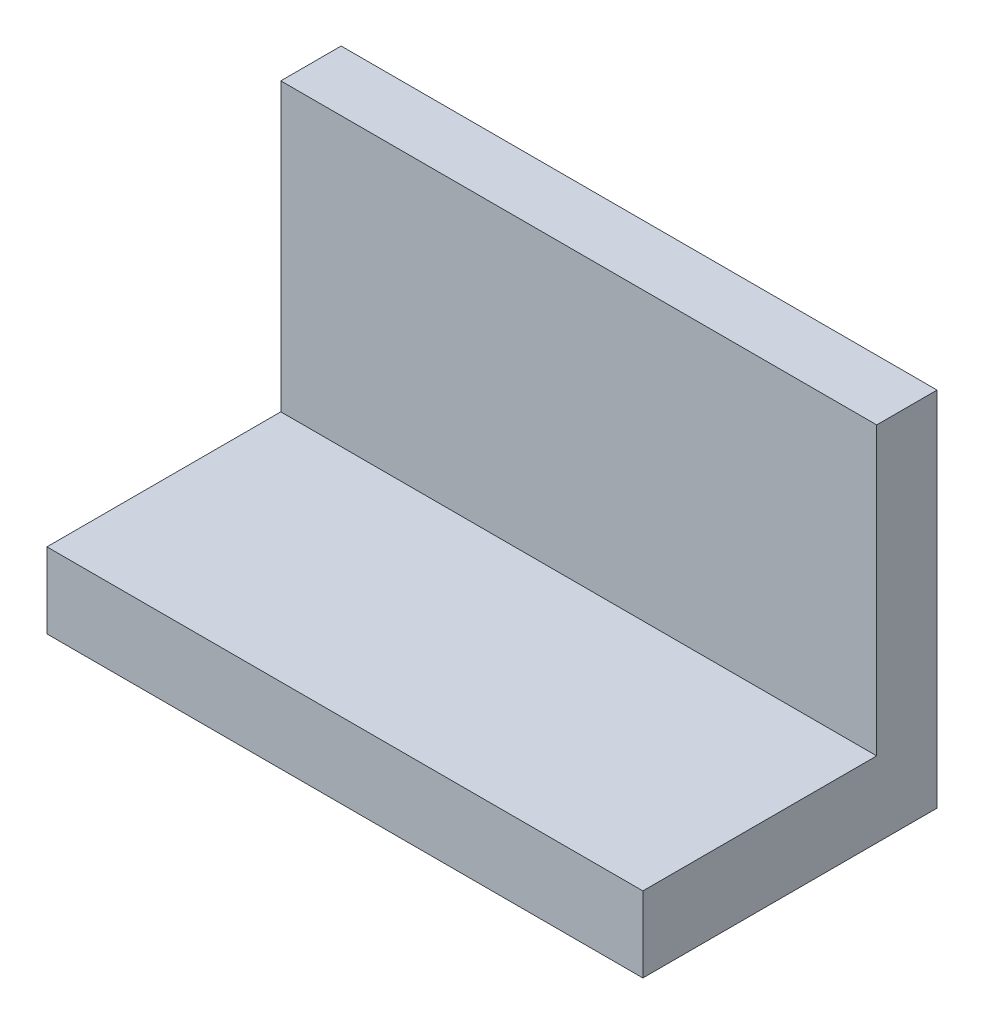
ISO-10303-21;
HEADER;
FILE_DESCRIPTION(('STEP AP214'),'2;1');
FILE_NAME('part.step','',(''),(''),'','','');
FILE_SCHEMA(('AUTOMOTIVE_DESIGN { 1 0 10303 214 1 1 1 1 }'));
ENDSEC;
DATA;
#1=APPLICATION_CONTEXT('core data for automotive mechanical design processes');
#2=APPLICATION_PROTOCOL_DEFINITION('international standard','automotive_design',2000,#1);
#3=PRODUCT_CONTEXT('',#1,'mechanical');
#4=PRODUCT('Part','Part','',(#3));
#5=PRODUCT_RELATED_PRODUCT_CATEGORY('part','',(#4));
#6=PRODUCT_DEFINITION_FORMATION('','',#4);
#7=PRODUCT_DEFINITION_CONTEXT('part definition',#1,'design');
#8=PRODUCT_DEFINITION('design','',#6,#7);
#9=PRODUCT_DEFINITION_SHAPE('','',#8);
#10=(LENGTH_UNIT() NAMED_UNIT(*) SI_UNIT(.MILLI.,.METRE.));
#11=(NAMED_UNIT(*) PLANE_ANGLE_UNIT() SI_UNIT($,.RADIAN.));
#12=(NAMED_UNIT(*) SI_UNIT($,.STERADIAN.) SOLID_ANGLE_UNIT());
#13=UNCERTAINTY_MEASURE_WITH_UNIT(LENGTH_MEASURE(1.E-05),#10,'distance_accuracy_value','');
#14=(GEOMETRIC_REPRESENTATION_CONTEXT(3) GLOBAL_UNCERTAINTY_ASSIGNED_CONTEXT((#13)) GLOBAL_UNIT_ASSIGNED_CONTEXT((#10,
#11,#12)) REPRESENTATION_CONTEXT('',''));
#15=CARTESIAN_POINT('',(0.,0.,0.));
#16=DIRECTION('',(0.,0.,1.));
#17=DIRECTION('',(1.,0.,0.));
#18=AXIS2_PLACEMENT_3D('',#15,#16,#17);
#19=CARTESIAN_POINT('',(7.9,9.6,3.9));
#20=DIRECTION('',(0.,0.,-1.));
#21=DIRECTION('',(-1.,0.,0.));
#22=AXIS2_PLACEMENT_3D('',#19,#20,#21);
#23=PLANE('',#22);
#24=DIRECTION('',(1.,0.,0.));
#25=VECTOR('',#24,1.);
#26=CARTESIAN_POINT('',(-7.9,2.,3.9));
#27=LINE('',#26,#25);
#28=CARTESIAN_POINT('',(-7.9,2.,3.9));
#29=VERTEX_POINT('',#28);
#30=CARTESIAN_POINT('',(7.9,2.,3.9));
#31=VERTEX_POINT('',#30);
#32=EDGE_CURVE('E119',#29,#31,#27,.T.);
#33=ORIENTED_EDGE('',*,*,#32,.F.);
#34=DIRECTION('',(0.,-1.,0.));
#35=VECTOR('',#34,1.);
#36=CARTESIAN_POINT('',(-7.9,9.6,3.9));
#37=LINE('',#36,#35);
#38=CARTESIAN_POINT('',(-7.9,0.,3.9));
#39=VERTEX_POINT('',#38);
#40=EDGE_CURVE('E11',#29,#39,#37,.T.);
#41=ORIENTED_EDGE('',*,*,#40,.T.);
#42=DIRECTION('',(1.,0.,0.));
#43=VECTOR('',#42,1.);
#44=CARTESIAN_POINT('',(7.9,0.,3.9));
#45=LINE('',#44,#43);
#46=CARTESIAN_POINT('',(7.9,0.,3.9));
#47=VERTEX_POINT('',#46);
#48=EDGE_CURVE('E98',#39,#47,#45,.T.);
#49=ORIENTED_EDGE('',*,*,#48,.T.);
#50=DIRECTION('',(0.,-1.,0.));
#51=VECTOR('',#50,1.);
#52=CARTESIAN_POINT('',(7.9,9.6,3.9));
#53=LINE('',#52,#51);
#54=EDGE_CURVE('E41',#31,#47,#53,.T.);
#55=ORIENTED_EDGE('',*,*,#54,.F.);
#56=EDGE_LOOP('',(#33,#41,#49,#55));
#57=FACE_BOUND('',#56,.T.);
#58=ADVANCED_FACE('F33',(#57),#23,.F.);
#59=CARTESIAN_POINT('',(-7.9,9.6,3.9));
#60=DIRECTION('',(1.,0.,0.));
#61=DIRECTION('',(0.,0.,-1.));
#62=AXIS2_PLACEMENT_3D('',#59,#60,#61);
#63=PLANE('',#62);
#64=DIRECTION('',(0.,0.,1.));
#65=VECTOR('',#64,1.);
#66=CARTESIAN_POINT('',(-7.9,2.,-2.299999898));
#67=LINE('',#66,#65);
#68=CARTESIAN_POINT('',(-7.9,2.,-2.299999898));
#69=VERTEX_POINT('',#68);
#70=EDGE_CURVE('E121',#69,#29,#67,.T.);
#71=ORIENTED_EDGE('',*,*,#70,.F.);
#72=DIRECTION('',(0.,1.,0.));
#73=VECTOR('',#72,1.);
#74=CARTESIAN_POINT('',(-7.9,2.,-2.299999898));
#75=LINE('',#74,#73);
#76=CARTESIAN_POINT('',(-7.9,9.6,-2.299999898));
#77=VERTEX_POINT('',#76);
#78=EDGE_CURVE('E99',#69,#77,#75,.T.);
#79=ORIENTED_EDGE('',*,*,#78,.T.);
#80=DIRECTION('',(0.,0.,1.));
#81=VECTOR('',#80,1.);
#82=CARTESIAN_POINT('',(-7.9,9.6,3.9));
#83=LINE('',#82,#81);
#84=CARTESIAN_POINT('',(-7.9,9.6,-3.9));
#85=VERTEX_POINT('',#84);
#86=EDGE_CURVE('E85',#85,#77,#83,.T.);
#87=ORIENTED_EDGE('',*,*,#86,.F.);
#88=DIRECTION('',(0.,-1.,0.));
#89=VECTOR('',#88,1.);
#90=CARTESIAN_POINT('',(-7.9,9.6,-3.9));
#91=LINE('',#90,#89);
#92=CARTESIAN_POINT('',(-7.9,0.,-3.9));
#93=VERTEX_POINT('',#92);
#94=EDGE_CURVE('E78',#85,#93,#91,.T.);
#95=ORIENTED_EDGE('',*,*,#94,.T.);
#96=DIRECTION('',(0.,0.,1.));
#97=VECTOR('',#96,1.);
#98=CARTESIAN_POINT('',(-7.9,0.,3.9));
#99=LINE('',#98,#97);
#100=EDGE_CURVE('E92',#93,#39,#99,.T.);
#101=ORIENTED_EDGE('',*,*,#100,.T.);
#102=ORIENTED_EDGE('',*,*,#40,.F.);
#103=EDGE_LOOP('',(#71,#79,#87,#95,#101,#102));
#104=FACE_BOUND('',#103,.T.);
#105=ADVANCED_FACE('F35',(#104),#63,.F.);
#106=CARTESIAN_POINT('',(7.9,9.6,3.9));
#107=DIRECTION('',(-1.,0.,0.));
#108=DIRECTION('',(0.,0.,1.));
#109=AXIS2_PLACEMENT_3D('',#106,#107,#108);
#110=PLANE('',#109);
#111=DIRECTION('',(0.,0.,-1.));
#112=VECTOR('',#111,1.);
#113=CARTESIAN_POINT('',(7.9,9.6,3.9));
#114=LINE('',#113,#112);
#115=CARTESIAN_POINT('',(7.9,9.6,-2.299999898));
#116=VERTEX_POINT('',#115);
#117=CARTESIAN_POINT('',(7.9,9.6,-3.9));
#118=VERTEX_POINT('',#117);
#119=EDGE_CURVE('E142',#116,#118,#114,.T.);
#120=ORIENTED_EDGE('',*,*,#119,.F.);
#121=DIRECTION('',(0.,1.,0.));
#122=VECTOR('',#121,1.);
#123=CARTESIAN_POINT('',(7.9,2.,-2.299999898));
#124=LINE('',#123,#122);
#125=CARTESIAN_POINT('',(7.9,2.,-2.299999898));
#126=VERTEX_POINT('',#125);
#127=EDGE_CURVE('E48',#126,#116,#124,.T.);
#128=ORIENTED_EDGE('',*,*,#127,.F.);
#129=DIRECTION('',(0.,0.,-1.));
#130=VECTOR('',#129,1.);
#131=CARTESIAN_POINT('',(7.9,2.,-2.299999898));
#132=LINE('',#131,#130);
#133=EDGE_CURVE('E114',#31,#126,#132,.T.);
#134=ORIENTED_EDGE('',*,*,#133,.F.);
#135=ORIENTED_EDGE('',*,*,#54,.T.);
#136=DIRECTION('',(0.,0.,-1.));
#137=VECTOR('',#136,1.);
#138=CARTESIAN_POINT('',(7.9,0.,3.9));
#139=LINE('',#138,#137);
#140=CARTESIAN_POINT('',(7.9,0.,-3.9));
#141=VERTEX_POINT('',#140);
#142=EDGE_CURVE('E86',#47,#141,#139,.T.);
#143=ORIENTED_EDGE('',*,*,#142,.T.);
#144=DIRECTION('',(0.,-1.,0.));
#145=VECTOR('',#144,1.);
#146=CARTESIAN_POINT('',(7.9,9.6,-3.9));
#147=LINE('',#146,#145);
#148=EDGE_CURVE('E81',#118,#141,#147,.T.);
#149=ORIENTED_EDGE('',*,*,#148,.F.);
#150=EDGE_LOOP('',(#120,#128,#134,#135,#143,#149));
#151=FACE_BOUND('',#150,.T.);
#152=ADVANCED_FACE('F111',(#151),#110,.F.);
#153=CARTESIAN_POINT('',(7.9,9.6,-3.9));
#154=DIRECTION('',(0.,0.,1.));
#155=DIRECTION('',(1.,0.,0.));
#156=AXIS2_PLACEMENT_3D('',#153,#154,#155);
#157=PLANE('',#156);
#158=DIRECTION('',(-1.,0.,0.));
#159=VECTOR('',#158,1.);
#160=CARTESIAN_POINT('',(7.9,0.,-3.9));
#161=LINE('',#160,#159);
#162=EDGE_CURVE('E75',#141,#93,#161,.T.);
#163=ORIENTED_EDGE('',*,*,#162,.T.);
#164=ORIENTED_EDGE('',*,*,#94,.F.);
#165=DIRECTION('',(-1.,0.,0.));
#166=VECTOR('',#165,1.);
#167=CARTESIAN_POINT('',(7.9,9.6,-3.9));
#168=LINE('',#167,#166);
#169=EDGE_CURVE('E57',#118,#85,#168,.T.);
#170=ORIENTED_EDGE('',*,*,#169,.F.);
#171=ORIENTED_EDGE('',*,*,#148,.T.);
#172=EDGE_LOOP('',(#163,#164,#170,#171));
#173=FACE_BOUND('',#172,.T.);
#174=ADVANCED_FACE('F77',(#173),#157,.F.);
#175=CARTESIAN_POINT('',(0.,9.6,0.));
#176=DIRECTION('',(0.,1.,0.));
#177=DIRECTION('',(0.,0.,1.));
#178=AXIS2_PLACEMENT_3D('',#175,#176,#177);
#179=PLANE('',#178);
#180=DIRECTION('',(-1.,0.,0.));
#181=VECTOR('',#180,1.);
#182=CARTESIAN_POINT('',(-7.9,9.6,-2.299999898));
#183=LINE('',#182,#181);
#184=EDGE_CURVE('E133',#116,#77,#183,.T.);
#185=ORIENTED_EDGE('',*,*,#184,.F.);
#186=ORIENTED_EDGE('',*,*,#119,.T.);
#187=ORIENTED_EDGE('',*,*,#169,.T.);
#188=ORIENTED_EDGE('',*,*,#86,.T.);
#189=EDGE_LOOP('',(#185,#186,#187,#188));
#190=FACE_BOUND('',#189,.T.);
#191=ADVANCED_FACE('F143',(#190),#179,.T.);
#192=CARTESIAN_POINT('',(0.,0.,0.));
#193=DIRECTION('',(0.,1.,0.));
#194=DIRECTION('',(0.,0.,1.));
#195=AXIS2_PLACEMENT_3D('',#192,#193,#194);
#196=PLANE('',#195);
#197=CARTESIAN_POINT('',(-4.,0.,-7.39999988369489E-08));
#198=DIRECTION('',(0.,-1.,0.));
#199=DIRECTION('',(0.,0.,-1.));
#200=AXIS2_PLACEMENT_3D('',#197,#198,#199);
#201=CIRCLE('',#200,2.5);
#202=CARTESIAN_POINT('',(-4.,0.,-2.500000074));
#203=VERTEX_POINT('',#202);
#204=EDGE_CURVE('E246',#203,#203,#201,.T.);
#205=ORIENTED_EDGE('',*,*,#204,.F.);
#206=EDGE_LOOP('',(#205));
#207=FACE_BOUND('',#206,.T.);
#208=CARTESIAN_POINT('',(3.874,0.,-7.39999988369489E-08));
#209=DIRECTION('',(0.,-1.,0.));
#210=DIRECTION('',(0.,0.,-1.));
#211=AXIS2_PLACEMENT_3D('',#208,#209,#210);
#212=CIRCLE('',#211,2.5);
#213=CARTESIAN_POINT('',(3.874,0.,-2.500000074));
#214=VERTEX_POINT('',#213);
#215=EDGE_CURVE('E254',#214,#214,#212,.T.);
#216=ORIENTED_EDGE('',*,*,#215,.F.);
#217=EDGE_LOOP('',(#216));
#218=FACE_BOUND('',#217,.T.);
#219=ORIENTED_EDGE('',*,*,#100,.F.);
#220=ORIENTED_EDGE('',*,*,#162,.F.);
#221=ORIENTED_EDGE('',*,*,#142,.F.);
#222=ORIENTED_EDGE('',*,*,#48,.F.);
#223=EDGE_LOOP('',(#219,#220,#221,#222));
#224=FACE_BOUND('',#223,.T.);
#225=ADVANCED_FACE('F96',(#207,#218,#224),#196,.F.);
#226=CARTESIAN_POINT('',(-7.9,2.,-2.299999898));
#227=DIRECTION('',(0.,0.,-1.));
#228=DIRECTION('',(-1.,0.,0.));
#229=AXIS2_PLACEMENT_3D('',#226,#227,#228);
#230=PLANE('',#229);
#231=ORIENTED_EDGE('',*,*,#184,.T.);
#232=ORIENTED_EDGE('',*,*,#78,.F.);
#233=DIRECTION('',(-1.,0.,0.));
#234=VECTOR('',#233,1.);
#235=CARTESIAN_POINT('',(-7.9,2.,-2.299999898));
#236=LINE('',#235,#234);
#237=EDGE_CURVE('E132',#126,#69,#236,.T.);
#238=ORIENTED_EDGE('',*,*,#237,.F.);
#239=ORIENTED_EDGE('',*,*,#127,.T.);
#240=EDGE_LOOP('',(#231,#232,#238,#239));
#241=FACE_BOUND('',#240,.T.);
#242=ADVANCED_FACE('F131',(#241),#230,.F.);
#243=CARTESIAN_POINT('',(0.,2.,0.));
#244=DIRECTION('',(0.,1.,0.));
#245=DIRECTION('',(0.,0.,1.));
#246=AXIS2_PLACEMENT_3D('',#243,#244,#245);
#247=PLANE('',#246);
#248=ORIENTED_EDGE('',*,*,#70,.T.);
#249=ORIENTED_EDGE('',*,*,#32,.T.);
#250=ORIENTED_EDGE('',*,*,#133,.T.);
#251=ORIENTED_EDGE('',*,*,#237,.T.);
#252=EDGE_LOOP('',(#248,#249,#250,#251));
#253=FACE_BOUND('',#252,.T.);
#254=ADVANCED_FACE('F134',(#253),#247,.T.);
#255=CARTESIAN_POINT('',(3.874,1.8,-7.39999988369489E-08));
#256=DIRECTION('',(0.,-1.,0.));
#257=DIRECTION('',(0.,0.,-1.));
#258=AXIS2_PLACEMENT_3D('',#255,#256,#257);
#259=CYLINDRICAL_SURFACE('',#258,2.5);
#260=CARTESIAN_POINT('',(3.874,1.8,-7.39999988369489E-08));
#261=DIRECTION('',(0.,-1.,0.));
#262=DIRECTION('',(0.,0.,-1.));
#263=AXIS2_PLACEMENT_3D('',#260,#261,#262);
#264=CIRCLE('',#263,2.5);
#265=CARTESIAN_POINT('',(3.874,1.8,-2.500000074));
#266=VERTEX_POINT('',#265);
#267=EDGE_CURVE('E249',#266,#266,#264,.T.);
#268=ORIENTED_EDGE('',*,*,#267,.F.);
#269=EDGE_LOOP('',(#268));
#270=FACE_BOUND('',#269,.T.);
#271=ORIENTED_EDGE('',*,*,#215,.T.);
#272=EDGE_LOOP('',(#271));
#273=FACE_BOUND('',#272,.T.);
#274=ADVANCED_FACE('F199',(#270,#273),#259,.F.);
#275=CARTESIAN_POINT('',(3.874,1.8,-7.39999988369489E-08));
#276=DIRECTION('',(0.,-1.,0.));
#277=DIRECTION('',(0.,0.,-1.));
#278=AXIS2_PLACEMENT_3D('',#275,#276,#277);
#279=PLANE('',#278);
#280=ORIENTED_EDGE('',*,*,#267,.T.);
#281=EDGE_LOOP('',(#280));
#282=FACE_BOUND('',#281,.T.);
#283=ADVANCED_FACE('F207',(#282),#279,.T.);
#284=CARTESIAN_POINT('',(-4.,1.8,-7.39999988369489E-08));
#285=DIRECTION('',(0.,-1.,0.));
#286=DIRECTION('',(0.,0.,-1.));
#287=AXIS2_PLACEMENT_3D('',#284,#285,#286);
#288=CYLINDRICAL_SURFACE('',#287,2.5);
#289=CARTESIAN_POINT('',(-4.,1.8,-7.39999988369489E-08));
#290=DIRECTION('',(0.,-1.,0.));
#291=DIRECTION('',(0.,0.,-1.));
#292=AXIS2_PLACEMENT_3D('',#289,#290,#291);
#293=CIRCLE('',#292,2.5);
#294=CARTESIAN_POINT('',(-4.,1.8,-2.500000074));
#295=VERTEX_POINT('',#294);
#296=EDGE_CURVE('E140',#295,#295,#293,.T.);
#297=ORIENTED_EDGE('',*,*,#296,.F.);
#298=EDGE_LOOP('',(#297));
#299=FACE_BOUND('',#298,.T.);
#300=ORIENTED_EDGE('',*,*,#204,.T.);
#301=EDGE_LOOP('',(#300));
#302=FACE_BOUND('',#301,.T.);
#303=ADVANCED_FACE('F216',(#299,#302),#288,.F.);
#304=CARTESIAN_POINT('',(-4.,1.8,-7.39999988369489E-08));
#305=DIRECTION('',(0.,-1.,0.));
#306=DIRECTION('',(0.,0.,-1.));
#307=AXIS2_PLACEMENT_3D('',#304,#305,#306);
#308=PLANE('',#307);
#309=ORIENTED_EDGE('',*,*,#296,.T.);
#310=EDGE_LOOP('',(#309));
#311=FACE_BOUND('',#310,.T.);
#312=ADVANCED_FACE('F225',(#311),#308,.T.);
#313=CLOSED_SHELL('',(#58,#105,#152,#174,#191,#225,#242,#254,#274,#283,#303,#312));
#314=MANIFOLD_SOLID_BREP('B2',#313);
#315=ADVANCED_BREP_SHAPE_REPRESENTATION('',(#18,#314),#14);
#316=SHAPE_DEFINITION_REPRESENTATION(#9,#315);
ENDSEC;
END-ISO-10303-21;
